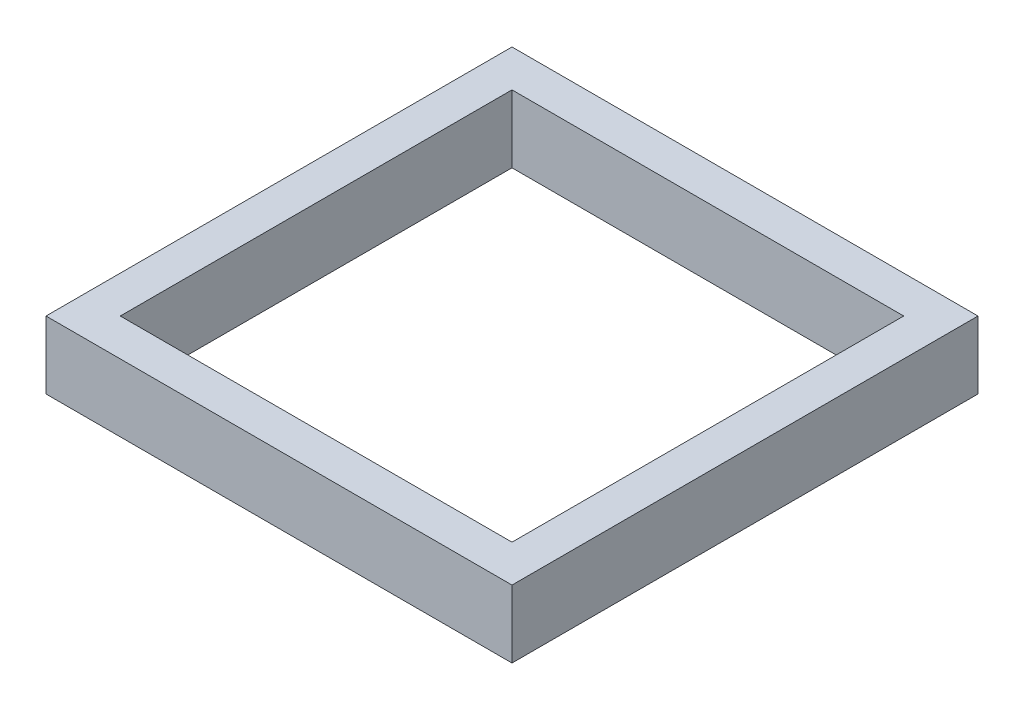
ISO-10303-21;
HEADER;
FILE_DESCRIPTION(('STEP AP214'),'2;1');
FILE_NAME('part.step','',(''),(''),'','','');
FILE_SCHEMA(('AUTOMOTIVE_DESIGN { 1 0 10303 214 1 1 1 1 }'));
ENDSEC;
DATA;
#1=APPLICATION_CONTEXT('core data for automotive mechanical design processes');
#2=APPLICATION_PROTOCOL_DEFINITION('international standard','automotive_design',2000,#1);
#3=PRODUCT_CONTEXT('',#1,'mechanical');
#4=PRODUCT('Part','Part','',(#3));
#5=PRODUCT_RELATED_PRODUCT_CATEGORY('part','',(#4));
#6=PRODUCT_DEFINITION_FORMATION('','',#4);
#7=PRODUCT_DEFINITION_CONTEXT('part definition',#1,'design');
#8=PRODUCT_DEFINITION('design','',#6,#7);
#9=PRODUCT_DEFINITION_SHAPE('','',#8);
#10=(LENGTH_UNIT() NAMED_UNIT(*) SI_UNIT(.MILLI.,.METRE.));
#11=(NAMED_UNIT(*) PLANE_ANGLE_UNIT() SI_UNIT($,.RADIAN.));
#12=(NAMED_UNIT(*) SI_UNIT($,.STERADIAN.) SOLID_ANGLE_UNIT());
#13=UNCERTAINTY_MEASURE_WITH_UNIT(LENGTH_MEASURE(1.E-05),#10,'distance_accuracy_value','');
#14=(GEOMETRIC_REPRESENTATION_CONTEXT(3) GLOBAL_UNCERTAINTY_ASSIGNED_CONTEXT((#13)) GLOBAL_UNIT_ASSIGNED_CONTEXT((#10,
#11,#12)) REPRESENTATION_CONTEXT('',''));
#15=CARTESIAN_POINT('',(0.,0.,0.));
#16=DIRECTION('',(0.,0.,1.));
#17=DIRECTION('',(1.,0.,0.));
#18=AXIS2_PLACEMENT_3D('',#15,#16,#17);
#19=CARTESIAN_POINT('',(0.,127.,0.));
#20=DIRECTION('',(0.,1.,0.));
#21=DIRECTION('',(0.,0.,1.));
#22=AXIS2_PLACEMENT_3D('',#19,#20,#21);
#23=PLANE('',#22);
#24=DIRECTION('',(0.,0.,-1.));
#25=VECTOR('',#24,1.);
#26=CARTESIAN_POINT('',(438.15,127.,-438.15));
#27=LINE('',#26,#25);
#28=CARTESIAN_POINT('',(438.15,127.,438.15));
#29=VERTEX_POINT('',#28);
#30=CARTESIAN_POINT('',(438.15,127.,-438.15));
#31=VERTEX_POINT('',#30);
#32=EDGE_CURVE('E138',#29,#31,#27,.T.);
#33=ORIENTED_EDGE('',*,*,#32,.T.);
#34=DIRECTION('',(-1.,0.,0.));
#35=VECTOR('',#34,1.);
#36=CARTESIAN_POINT('',(-438.15,127.,-438.15));
#37=LINE('',#36,#35);
#38=CARTESIAN_POINT('',(-438.15,127.,-438.15));
#39=VERTEX_POINT('',#38);
#40=EDGE_CURVE('E141',#31,#39,#37,.T.);
#41=ORIENTED_EDGE('',*,*,#40,.T.);
#42=DIRECTION('',(0.,0.,1.));
#43=VECTOR('',#42,1.);
#44=CARTESIAN_POINT('',(-438.15,127.,-438.15));
#45=LINE('',#44,#43);
#46=CARTESIAN_POINT('',(-438.15,127.,438.15));
#47=VERTEX_POINT('',#46);
#48=EDGE_CURVE('E144',#39,#47,#45,.T.);
#49=ORIENTED_EDGE('',*,*,#48,.T.);
#50=DIRECTION('',(1.,0.,0.));
#51=VECTOR('',#50,1.);
#52=CARTESIAN_POINT('',(-438.15,127.,438.15));
#53=LINE('',#52,#51);
#54=EDGE_CURVE('E146',#47,#29,#53,.T.);
#55=ORIENTED_EDGE('',*,*,#54,.T.);
#56=EDGE_LOOP('',(#33,#41,#49,#55));
#57=FACE_BOUND('',#56,.T.);
#58=DIRECTION('',(-1.,0.,0.));
#59=VECTOR('',#58,1.);
#60=CARTESIAN_POINT('',(-368.3,127.,-368.3));
#61=LINE('',#60,#59);
#62=CARTESIAN_POINT('',(368.3,127.,-368.3));
#63=VERTEX_POINT('',#62);
#64=CARTESIAN_POINT('',(-368.3,127.,-368.3));
#65=VERTEX_POINT('',#64);
#66=EDGE_CURVE('E110',#63,#65,#61,.T.);
#67=ORIENTED_EDGE('',*,*,#66,.F.);
#68=DIRECTION('',(0.,0.,-1.));
#69=VECTOR('',#68,1.);
#70=CARTESIAN_POINT('',(368.3,127.,-368.3));
#71=LINE('',#70,#69);
#72=CARTESIAN_POINT('',(368.3,127.,368.3));
#73=VERTEX_POINT('',#72);
#74=EDGE_CURVE('E102',#73,#63,#71,.T.);
#75=ORIENTED_EDGE('',*,*,#74,.F.);
#76=DIRECTION('',(1.,0.,0.));
#77=VECTOR('',#76,1.);
#78=CARTESIAN_POINT('',(-368.3,127.,368.3));
#79=LINE('',#78,#77);
#80=CARTESIAN_POINT('',(-368.3,127.,368.3));
#81=VERTEX_POINT('',#80);
#82=EDGE_CURVE('E124',#81,#73,#79,.T.);
#83=ORIENTED_EDGE('',*,*,#82,.F.);
#84=DIRECTION('',(0.,0.,1.));
#85=VECTOR('',#84,1.);
#86=CARTESIAN_POINT('',(-368.3,127.,-368.3));
#87=LINE('',#86,#85);
#88=EDGE_CURVE('E122',#65,#81,#87,.T.);
#89=ORIENTED_EDGE('',*,*,#88,.F.);
#90=EDGE_LOOP('',(#67,#75,#83,#89));
#91=FACE_BOUND('',#90,.T.);
#92=ADVANCED_FACE('F37',(#57,#91),#23,.T.);
#93=CARTESIAN_POINT('',(0.,0.,0.));
#94=DIRECTION('',(0.,1.,0.));
#95=DIRECTION('',(0.,0.,1.));
#96=AXIS2_PLACEMENT_3D('',#93,#94,#95);
#97=PLANE('',#96);
#98=DIRECTION('',(0.,0.,-1.));
#99=VECTOR('',#98,1.);
#100=CARTESIAN_POINT('',(438.15,0.,-438.15));
#101=LINE('',#100,#99);
#102=CARTESIAN_POINT('',(438.15,0.,438.15));
#103=VERTEX_POINT('',#102);
#104=CARTESIAN_POINT('',(438.15,0.,-438.15));
#105=VERTEX_POINT('',#104);
#106=EDGE_CURVE('E118',#103,#105,#101,.T.);
#107=ORIENTED_EDGE('',*,*,#106,.F.);
#108=DIRECTION('',(1.,0.,0.));
#109=VECTOR('',#108,1.);
#110=CARTESIAN_POINT('',(-438.15,0.,438.15));
#111=LINE('',#110,#109);
#112=CARTESIAN_POINT('',(-438.15,0.,438.15));
#113=VERTEX_POINT('',#112);
#114=EDGE_CURVE('E142',#113,#103,#111,.T.);
#115=ORIENTED_EDGE('',*,*,#114,.F.);
#116=DIRECTION('',(0.,0.,1.));
#117=VECTOR('',#116,1.);
#118=CARTESIAN_POINT('',(-438.15,0.,-438.15));
#119=LINE('',#118,#117);
#120=CARTESIAN_POINT('',(-438.15,0.,-438.15));
#121=VERTEX_POINT('',#120);
#122=EDGE_CURVE('E153',#121,#113,#119,.T.);
#123=ORIENTED_EDGE('',*,*,#122,.F.);
#124=DIRECTION('',(-1.,0.,0.));
#125=VECTOR('',#124,1.);
#126=CARTESIAN_POINT('',(-438.15,0.,-438.15));
#127=LINE('',#126,#125);
#128=EDGE_CURVE('E151',#105,#121,#127,.T.);
#129=ORIENTED_EDGE('',*,*,#128,.F.);
#130=EDGE_LOOP('',(#107,#115,#123,#129));
#131=FACE_BOUND('',#130,.T.);
#132=DIRECTION('',(0.,0.,-1.));
#133=VECTOR('',#132,1.);
#134=CARTESIAN_POINT('',(368.3,0.,-368.3));
#135=LINE('',#134,#133);
#136=CARTESIAN_POINT('',(368.3,0.,368.3));
#137=VERTEX_POINT('',#136);
#138=CARTESIAN_POINT('',(368.3,0.,-368.3));
#139=VERTEX_POINT('',#138);
#140=EDGE_CURVE('E60',#137,#139,#135,.T.);
#141=ORIENTED_EDGE('',*,*,#140,.T.);
#142=DIRECTION('',(-1.,0.,0.));
#143=VECTOR('',#142,1.);
#144=CARTESIAN_POINT('',(-368.3,0.,-368.3));
#145=LINE('',#144,#143);
#146=CARTESIAN_POINT('',(-368.3,0.,-368.3));
#147=VERTEX_POINT('',#146);
#148=EDGE_CURVE('E117',#139,#147,#145,.T.);
#149=ORIENTED_EDGE('',*,*,#148,.T.);
#150=DIRECTION('',(0.,0.,1.));
#151=VECTOR('',#150,1.);
#152=CARTESIAN_POINT('',(-368.3,0.,-368.3));
#153=LINE('',#152,#151);
#154=CARTESIAN_POINT('',(-368.3,0.,368.3));
#155=VERTEX_POINT('',#154);
#156=EDGE_CURVE('E130',#147,#155,#153,.T.);
#157=ORIENTED_EDGE('',*,*,#156,.T.);
#158=DIRECTION('',(1.,0.,0.));
#159=VECTOR('',#158,1.);
#160=CARTESIAN_POINT('',(-368.3,0.,368.3));
#161=LINE('',#160,#159);
#162=EDGE_CURVE('E111',#155,#137,#161,.T.);
#163=ORIENTED_EDGE('',*,*,#162,.T.);
#164=EDGE_LOOP('',(#141,#149,#157,#163));
#165=FACE_BOUND('',#164,.T.);
#166=ADVANCED_FACE('F171',(#131,#165),#97,.F.);
#167=CARTESIAN_POINT('',(438.15,127.,-438.15));
#168=DIRECTION('',(-1.,0.,0.));
#169=DIRECTION('',(0.,0.,1.));
#170=AXIS2_PLACEMENT_3D('',#167,#168,#169);
#171=PLANE('',#170);
#172=ORIENTED_EDGE('',*,*,#106,.T.);
#173=DIRECTION('',(0.,-1.,0.));
#174=VECTOR('',#173,1.);
#175=CARTESIAN_POINT('',(438.15,127.,-438.15));
#176=LINE('',#175,#174);
#177=EDGE_CURVE('E11',#31,#105,#176,.T.);
#178=ORIENTED_EDGE('',*,*,#177,.F.);
#179=ORIENTED_EDGE('',*,*,#32,.F.);
#180=DIRECTION('',(0.,-1.,0.));
#181=VECTOR('',#180,1.);
#182=CARTESIAN_POINT('',(438.15,127.,438.15));
#183=LINE('',#182,#181);
#184=EDGE_CURVE('E148',#29,#103,#183,.T.);
#185=ORIENTED_EDGE('',*,*,#184,.T.);
#186=EDGE_LOOP('',(#172,#178,#179,#185));
#187=FACE_BOUND('',#186,.T.);
#188=ADVANCED_FACE('F39',(#187),#171,.F.);
#189=CARTESIAN_POINT('',(-438.15,127.,-438.15));
#190=DIRECTION('',(0.,0.,1.));
#191=DIRECTION('',(1.,0.,0.));
#192=AXIS2_PLACEMENT_3D('',#189,#190,#191);
#193=PLANE('',#192);
#194=ORIENTED_EDGE('',*,*,#128,.T.);
#195=DIRECTION('',(0.,-1.,0.));
#196=VECTOR('',#195,1.);
#197=CARTESIAN_POINT('',(-438.15,127.,-438.15));
#198=LINE('',#197,#196);
#199=EDGE_CURVE('E45',#39,#121,#198,.T.);
#200=ORIENTED_EDGE('',*,*,#199,.F.);
#201=ORIENTED_EDGE('',*,*,#40,.F.);
#202=ORIENTED_EDGE('',*,*,#177,.T.);
#203=EDGE_LOOP('',(#194,#200,#201,#202));
#204=FACE_BOUND('',#203,.T.);
#205=ADVANCED_FACE('F181',(#204),#193,.F.);
#206=CARTESIAN_POINT('',(-438.15,127.,-438.15));
#207=DIRECTION('',(1.,0.,0.));
#208=DIRECTION('',(0.,0.,-1.));
#209=AXIS2_PLACEMENT_3D('',#206,#207,#208);
#210=PLANE('',#209);
#211=ORIENTED_EDGE('',*,*,#122,.T.);
#212=DIRECTION('',(0.,-1.,0.));
#213=VECTOR('',#212,1.);
#214=CARTESIAN_POINT('',(-438.15,127.,438.15));
#215=LINE('',#214,#213);
#216=EDGE_CURVE('E158',#47,#113,#215,.T.);
#217=ORIENTED_EDGE('',*,*,#216,.F.);
#218=ORIENTED_EDGE('',*,*,#48,.F.);
#219=ORIENTED_EDGE('',*,*,#199,.T.);
#220=EDGE_LOOP('',(#211,#217,#218,#219));
#221=FACE_BOUND('',#220,.T.);
#222=ADVANCED_FACE('F165',(#221),#210,.F.);
#223=CARTESIAN_POINT('',(-438.15,127.,438.15));
#224=DIRECTION('',(0.,0.,-1.));
#225=DIRECTION('',(-1.,0.,0.));
#226=AXIS2_PLACEMENT_3D('',#223,#224,#225);
#227=PLANE('',#226);
#228=ORIENTED_EDGE('',*,*,#114,.T.);
#229=ORIENTED_EDGE('',*,*,#184,.F.);
#230=ORIENTED_EDGE('',*,*,#54,.F.);
#231=ORIENTED_EDGE('',*,*,#216,.T.);
#232=EDGE_LOOP('',(#228,#229,#230,#231));
#233=FACE_BOUND('',#232,.T.);
#234=ADVANCED_FACE('F175',(#233),#227,.F.);
#235=CARTESIAN_POINT('',(368.3,127.,-368.3));
#236=DIRECTION('',(-1.,0.,0.));
#237=DIRECTION('',(0.,0.,1.));
#238=AXIS2_PLACEMENT_3D('',#235,#236,#237);
#239=PLANE('',#238);
#240=ORIENTED_EDGE('',*,*,#140,.F.);
#241=DIRECTION('',(0.,-1.,0.));
#242=VECTOR('',#241,1.);
#243=CARTESIAN_POINT('',(368.3,127.,368.3));
#244=LINE('',#243,#242);
#245=EDGE_CURVE('E106',#73,#137,#244,.T.);
#246=ORIENTED_EDGE('',*,*,#245,.F.);
#247=ORIENTED_EDGE('',*,*,#74,.T.);
#248=DIRECTION('',(0.,-1.,0.));
#249=VECTOR('',#248,1.);
#250=CARTESIAN_POINT('',(368.3,127.,-368.3));
#251=LINE('',#250,#249);
#252=EDGE_CURVE('E105',#63,#139,#251,.T.);
#253=ORIENTED_EDGE('',*,*,#252,.T.);
#254=EDGE_LOOP('',(#240,#246,#247,#253));
#255=FACE_BOUND('',#254,.T.);
#256=ADVANCED_FACE('F104',(#255),#239,.T.);
#257=CARTESIAN_POINT('',(-368.3,127.,-368.3));
#258=DIRECTION('',(0.,0.,1.));
#259=DIRECTION('',(1.,0.,0.));
#260=AXIS2_PLACEMENT_3D('',#257,#258,#259);
#261=PLANE('',#260);
#262=ORIENTED_EDGE('',*,*,#148,.F.);
#263=ORIENTED_EDGE('',*,*,#252,.F.);
#264=ORIENTED_EDGE('',*,*,#66,.T.);
#265=DIRECTION('',(0.,-1.,0.));
#266=VECTOR('',#265,1.);
#267=CARTESIAN_POINT('',(-368.3,127.,-368.3));
#268=LINE('',#267,#266);
#269=EDGE_CURVE('E119',#65,#147,#268,.T.);
#270=ORIENTED_EDGE('',*,*,#269,.T.);
#271=EDGE_LOOP('',(#262,#263,#264,#270));
#272=FACE_BOUND('',#271,.T.);
#273=ADVANCED_FACE('F114',(#272),#261,.T.);
#274=CARTESIAN_POINT('',(-368.3,127.,-368.3));
#275=DIRECTION('',(1.,0.,0.));
#276=DIRECTION('',(0.,0.,-1.));
#277=AXIS2_PLACEMENT_3D('',#274,#275,#276);
#278=PLANE('',#277);
#279=ORIENTED_EDGE('',*,*,#156,.F.);
#280=ORIENTED_EDGE('',*,*,#269,.F.);
#281=ORIENTED_EDGE('',*,*,#88,.T.);
#282=DIRECTION('',(0.,-1.,0.));
#283=VECTOR('',#282,1.);
#284=CARTESIAN_POINT('',(-368.3,127.,368.3));
#285=LINE('',#284,#283);
#286=EDGE_CURVE('E52',#81,#155,#285,.T.);
#287=ORIENTED_EDGE('',*,*,#286,.T.);
#288=EDGE_LOOP('',(#279,#280,#281,#287));
#289=FACE_BOUND('',#288,.T.);
#290=ADVANCED_FACE('F204',(#289),#278,.T.);
#291=CARTESIAN_POINT('',(-368.3,127.,368.3));
#292=DIRECTION('',(0.,0.,-1.));
#293=DIRECTION('',(-1.,0.,0.));
#294=AXIS2_PLACEMENT_3D('',#291,#292,#293);
#295=PLANE('',#294);
#296=ORIENTED_EDGE('',*,*,#162,.F.);
#297=ORIENTED_EDGE('',*,*,#286,.F.);
#298=ORIENTED_EDGE('',*,*,#82,.T.);
#299=ORIENTED_EDGE('',*,*,#245,.T.);
#300=EDGE_LOOP('',(#296,#297,#298,#299));
#301=FACE_BOUND('',#300,.T.);
#302=ADVANCED_FACE('F208',(#301),#295,.T.);
#303=CLOSED_SHELL('',(#92,#166,#188,#205,#222,#234,#256,#273,#290,#302));
#304=MANIFOLD_SOLID_BREP('B2',#303);
#305=ADVANCED_BREP_SHAPE_REPRESENTATION('',(#18,#304),#14);
#306=SHAPE_DEFINITION_REPRESENTATION(#9,#305);
ENDSEC;
END-ISO-10303-21;
